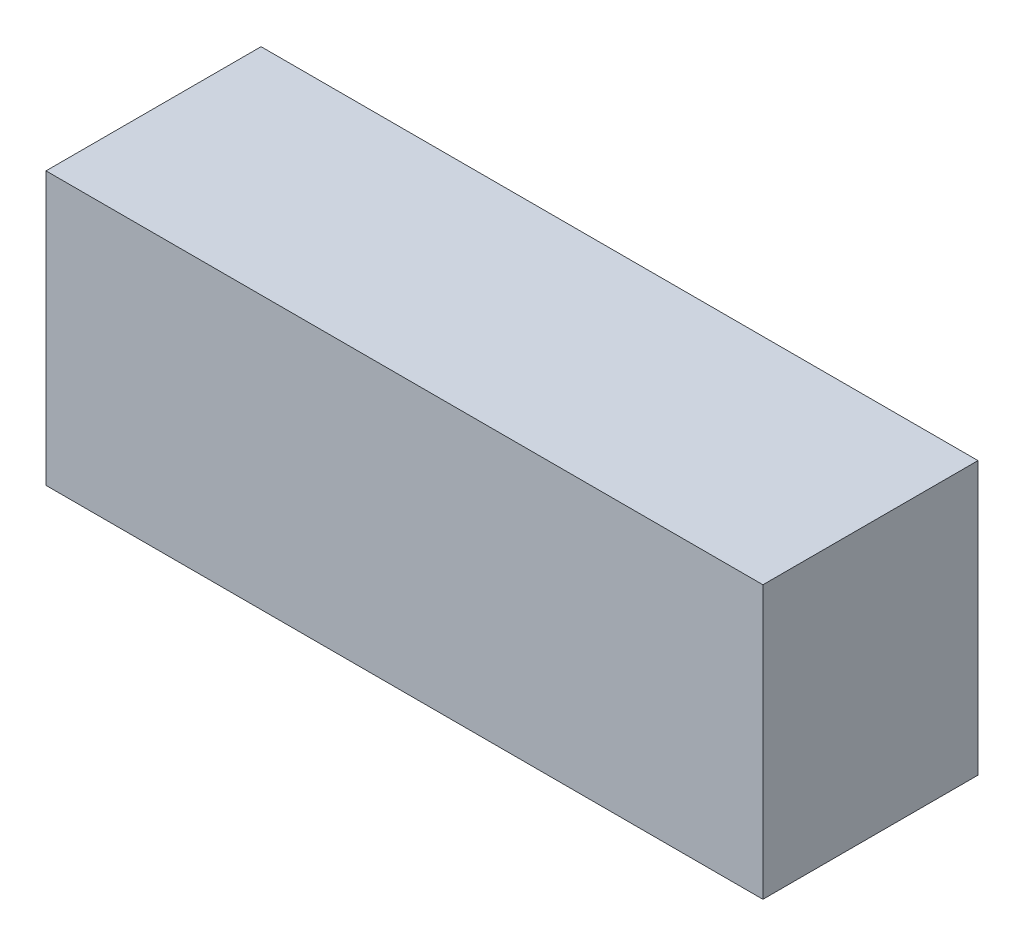
ISO-10303-21;
HEADER;
FILE_DESCRIPTION(('STEP AP214'),'2;1');
FILE_NAME('part.step','',(''),(''),'','','');
FILE_SCHEMA(('AUTOMOTIVE_DESIGN { 1 0 10303 214 1 1 1 1 }'));
ENDSEC;
DATA;
#1=APPLICATION_CONTEXT('core data for automotive mechanical design processes');
#2=APPLICATION_PROTOCOL_DEFINITION('international standard','automotive_design',2000,#1);
#3=PRODUCT_CONTEXT('',#1,'mechanical');
#4=PRODUCT('Part','Part','',(#3));
#5=PRODUCT_RELATED_PRODUCT_CATEGORY('part','',(#4));
#6=PRODUCT_DEFINITION_FORMATION('','',#4);
#7=PRODUCT_DEFINITION_CONTEXT('part definition',#1,'design');
#8=PRODUCT_DEFINITION('design','',#6,#7);
#9=PRODUCT_DEFINITION_SHAPE('','',#8);
#10=(LENGTH_UNIT() NAMED_UNIT(*) SI_UNIT(.MILLI.,.METRE.));
#11=(NAMED_UNIT(*) PLANE_ANGLE_UNIT() SI_UNIT($,.RADIAN.));
#12=(NAMED_UNIT(*) SI_UNIT($,.STERADIAN.) SOLID_ANGLE_UNIT());
#13=UNCERTAINTY_MEASURE_WITH_UNIT(LENGTH_MEASURE(1.E-05),#10,'distance_accuracy_value','');
#14=(GEOMETRIC_REPRESENTATION_CONTEXT(3) GLOBAL_UNCERTAINTY_ASSIGNED_CONTEXT((#13)) GLOBAL_UNIT_ASSIGNED_CONTEXT((#10,
#11,#12)) REPRESENTATION_CONTEXT('',''));
#15=CARTESIAN_POINT('',(0.,0.,0.));
#16=DIRECTION('',(0.,0.,1.));
#17=DIRECTION('',(1.,0.,0.));
#18=AXIS2_PLACEMENT_3D('',#15,#16,#17);
#19=CARTESIAN_POINT('',(-15.5958904109589,11.4,-3.35958904109589));
#20=DIRECTION('',(1.,0.,0.));
#21=DIRECTION('',(0.,0.,-1.));
#22=AXIS2_PLACEMENT_3D('',#19,#20,#21);
#23=PLANE('',#22);
#24=DIRECTION('',(0.,0.,1.));
#25=VECTOR('',#24,1.);
#26=CARTESIAN_POINT('',(-15.5958904109589,0.,-3.35958904109589));
#27=LINE('',#26,#25);
#28=CARTESIAN_POINT('',(-15.5958904109589,0.,-3.35958904109589));
#29=VERTEX_POINT('',#28);
#30=CARTESIAN_POINT('',(-15.5958904109589,0.,5.64041095890411));
#31=VERTEX_POINT('',#30);
#32=EDGE_CURVE('E95',#29,#31,#27,.T.);
#33=ORIENTED_EDGE('',*,*,#32,.T.);
#34=DIRECTION('',(0.,-1.,0.));
#35=VECTOR('',#34,1.);
#36=CARTESIAN_POINT('',(-15.5958904109589,11.4,5.64041095890411));
#37=LINE('',#36,#35);
#38=CARTESIAN_POINT('',(-15.5958904109589,11.4,5.64041095890411));
#39=VERTEX_POINT('',#38);
#40=EDGE_CURVE('E11',#39,#31,#37,.T.);
#41=ORIENTED_EDGE('',*,*,#40,.F.);
#42=DIRECTION('',(0.,0.,1.));
#43=VECTOR('',#42,1.);
#44=CARTESIAN_POINT('',(-15.5958904109589,11.4,-3.35958904109589));
#45=LINE('',#44,#43);
#46=CARTESIAN_POINT('',(-15.5958904109589,11.4,-3.35958904109589));
#47=VERTEX_POINT('',#46);
#48=EDGE_CURVE('E83',#47,#39,#45,.T.);
#49=ORIENTED_EDGE('',*,*,#48,.F.);
#50=DIRECTION('',(0.,-1.,0.));
#51=VECTOR('',#50,1.);
#52=CARTESIAN_POINT('',(-15.5958904109589,11.4,-3.35958904109589));
#53=LINE('',#52,#51);
#54=EDGE_CURVE('E91',#47,#29,#53,.T.);
#55=ORIENTED_EDGE('',*,*,#54,.T.);
#56=EDGE_LOOP('',(#33,#41,#49,#55));
#57=FACE_BOUND('',#56,.T.);
#58=ADVANCED_FACE('F32',(#57),#23,.F.);
#59=CARTESIAN_POINT('',(-15.5958904109589,11.4,5.64041095890411));
#60=DIRECTION('',(0.,0.,-1.));
#61=DIRECTION('',(-1.,0.,0.));
#62=AXIS2_PLACEMENT_3D('',#59,#60,#61);
#63=PLANE('',#62);
#64=DIRECTION('',(1.,0.,0.));
#65=VECTOR('',#64,1.);
#66=CARTESIAN_POINT('',(-15.5958904109589,0.,5.64041095890411));
#67=LINE('',#66,#65);
#68=CARTESIAN_POINT('',(14.4041095890411,0.,5.64041095890411));
#69=VERTEX_POINT('',#68);
#70=EDGE_CURVE('E87',#31,#69,#67,.T.);
#71=ORIENTED_EDGE('',*,*,#70,.T.);
#72=DIRECTION('',(0.,-1.,0.));
#73=VECTOR('',#72,1.);
#74=CARTESIAN_POINT('',(14.4041095890411,11.4,5.64041095890411));
#75=LINE('',#74,#73);
#76=CARTESIAN_POINT('',(14.4041095890411,11.4,5.64041095890411));
#77=VERTEX_POINT('',#76);
#78=EDGE_CURVE('E40',#77,#69,#75,.T.);
#79=ORIENTED_EDGE('',*,*,#78,.F.);
#80=DIRECTION('',(1.,0.,0.));
#81=VECTOR('',#80,1.);
#82=CARTESIAN_POINT('',(-15.5958904109589,11.4,5.64041095890411));
#83=LINE('',#82,#81);
#84=EDGE_CURVE('E78',#39,#77,#83,.T.);
#85=ORIENTED_EDGE('',*,*,#84,.F.);
#86=ORIENTED_EDGE('',*,*,#40,.T.);
#87=EDGE_LOOP('',(#71,#79,#85,#86));
#88=FACE_BOUND('',#87,.T.);
#89=ADVANCED_FACE('F86',(#88),#63,.F.);
#90=CARTESIAN_POINT('',(14.4041095890411,11.4,-3.35958904109589));
#91=DIRECTION('',(-1.,0.,0.));
#92=DIRECTION('',(0.,0.,1.));
#93=AXIS2_PLACEMENT_3D('',#90,#91,#92);
#94=PLANE('',#93);
#95=DIRECTION('',(0.,0.,-1.));
#96=VECTOR('',#95,1.);
#97=CARTESIAN_POINT('',(14.4041095890411,0.,-3.35958904109589));
#98=LINE('',#97,#96);
#99=CARTESIAN_POINT('',(14.4041095890411,0.,-3.35958904109589));
#100=VERTEX_POINT('',#99);
#101=EDGE_CURVE('E65',#69,#100,#98,.T.);
#102=ORIENTED_EDGE('',*,*,#101,.T.);
#103=DIRECTION('',(0.,-1.,0.));
#104=VECTOR('',#103,1.);
#105=CARTESIAN_POINT('',(14.4041095890411,11.4,-3.35958904109589));
#106=LINE('',#105,#104);
#107=CARTESIAN_POINT('',(14.4041095890411,11.4,-3.35958904109589));
#108=VERTEX_POINT('',#107);
#109=EDGE_CURVE('E88',#108,#100,#106,.T.);
#110=ORIENTED_EDGE('',*,*,#109,.F.);
#111=DIRECTION('',(0.,0.,-1.));
#112=VECTOR('',#111,1.);
#113=CARTESIAN_POINT('',(14.4041095890411,11.4,-3.35958904109589));
#114=LINE('',#113,#112);
#115=EDGE_CURVE('E81',#77,#108,#114,.T.);
#116=ORIENTED_EDGE('',*,*,#115,.F.);
#117=ORIENTED_EDGE('',*,*,#78,.T.);
#118=EDGE_LOOP('',(#102,#110,#116,#117));
#119=FACE_BOUND('',#118,.T.);
#120=ADVANCED_FACE('F89',(#119),#94,.F.);
#121=CARTESIAN_POINT('',(-15.5958904109589,11.4,-3.35958904109589));
#122=DIRECTION('',(0.,0.,1.));
#123=DIRECTION('',(1.,0.,0.));
#124=AXIS2_PLACEMENT_3D('',#121,#122,#123);
#125=PLANE('',#124);
#126=DIRECTION('',(-1.,0.,0.));
#127=VECTOR('',#126,1.);
#128=CARTESIAN_POINT('',(-15.5958904109589,0.,-3.35958904109589));
#129=LINE('',#128,#127);
#130=EDGE_CURVE('E71',#100,#29,#129,.T.);
#131=ORIENTED_EDGE('',*,*,#130,.T.);
#132=ORIENTED_EDGE('',*,*,#54,.F.);
#133=DIRECTION('',(-1.,0.,0.));
#134=VECTOR('',#133,1.);
#135=CARTESIAN_POINT('',(-15.5958904109589,11.4,-3.35958904109589));
#136=LINE('',#135,#134);
#137=EDGE_CURVE('E48',#108,#47,#136,.T.);
#138=ORIENTED_EDGE('',*,*,#137,.F.);
#139=ORIENTED_EDGE('',*,*,#109,.T.);
#140=EDGE_LOOP('',(#131,#132,#138,#139));
#141=FACE_BOUND('',#140,.T.);
#142=ADVANCED_FACE('F102',(#141),#125,.F.);
#143=CARTESIAN_POINT('',(0.,11.4,0.));
#144=DIRECTION('',(0.,1.,0.));
#145=DIRECTION('',(0.,0.,1.));
#146=AXIS2_PLACEMENT_3D('',#143,#144,#145);
#147=PLANE('',#146);
#148=ORIENTED_EDGE('',*,*,#48,.T.);
#149=ORIENTED_EDGE('',*,*,#84,.T.);
#150=ORIENTED_EDGE('',*,*,#115,.T.);
#151=ORIENTED_EDGE('',*,*,#137,.T.);
#152=EDGE_LOOP('',(#148,#149,#150,#151));
#153=FACE_BOUND('',#152,.T.);
#154=ADVANCED_FACE('F79',(#153),#147,.T.);
#155=CARTESIAN_POINT('',(0.,0.,0.));
#156=DIRECTION('',(0.,1.,0.));
#157=DIRECTION('',(0.,0.,1.));
#158=AXIS2_PLACEMENT_3D('',#155,#156,#157);
#159=PLANE('',#158);
#160=ORIENTED_EDGE('',*,*,#32,.F.);
#161=ORIENTED_EDGE('',*,*,#130,.F.);
#162=ORIENTED_EDGE('',*,*,#101,.F.);
#163=ORIENTED_EDGE('',*,*,#70,.F.);
#164=EDGE_LOOP('',(#160,#161,#162,#163));
#165=FACE_BOUND('',#164,.T.);
#166=ADVANCED_FACE('F105',(#165),#159,.F.);
#167=CLOSED_SHELL('',(#58,#89,#120,#142,#154,#166));
#168=MANIFOLD_SOLID_BREP('B2',#167);
#169=ADVANCED_BREP_SHAPE_REPRESENTATION('',(#18,#168),#14);
#170=SHAPE_DEFINITION_REPRESENTATION(#9,#169);
ENDSEC;
END-ISO-10303-21;
